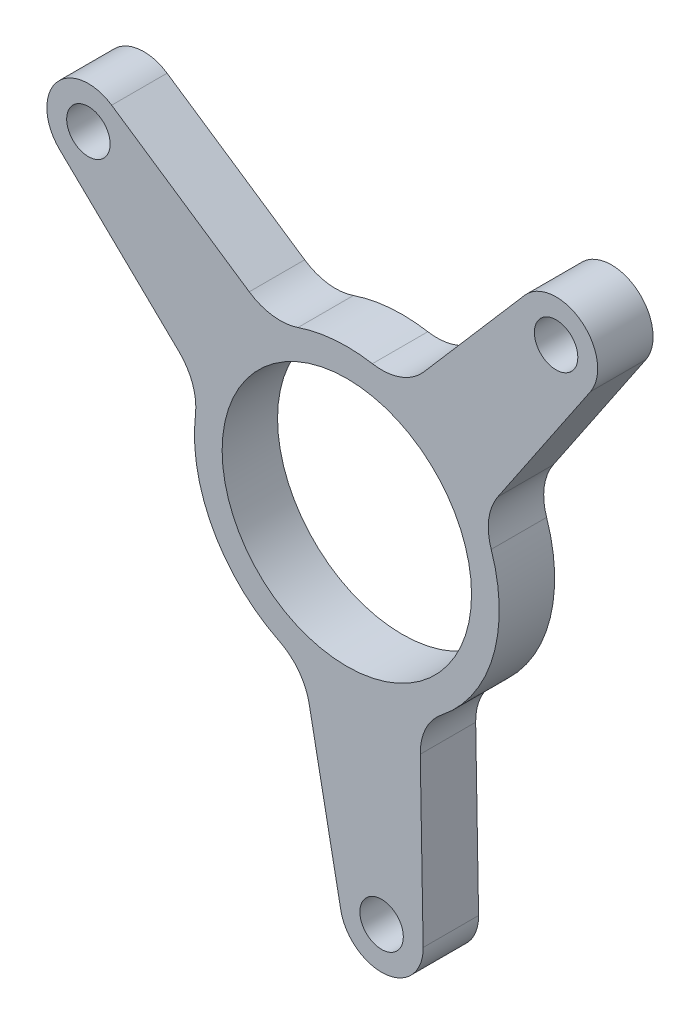
ISO-10303-21;
HEADER;
FILE_DESCRIPTION(('STEP AP214'),'2;1');
FILE_NAME('part.step','',(''),(''),'','','');
FILE_SCHEMA(('AUTOMOTIVE_DESIGN { 1 0 10303 214 1 1 1 1 }'));
ENDSEC;
DATA;
#1=APPLICATION_CONTEXT('core data for automotive mechanical design processes');
#2=APPLICATION_PROTOCOL_DEFINITION('international standard','automotive_design',2000,#1);
#3=PRODUCT_CONTEXT('',#1,'mechanical');
#4=PRODUCT('Part','Part','',(#3));
#5=PRODUCT_RELATED_PRODUCT_CATEGORY('part','',(#4));
#6=PRODUCT_DEFINITION_FORMATION('','',#4);
#7=PRODUCT_DEFINITION_CONTEXT('part definition',#1,'design');
#8=PRODUCT_DEFINITION('design','',#6,#7);
#9=PRODUCT_DEFINITION_SHAPE('','',#8);
#10=(LENGTH_UNIT() NAMED_UNIT(*) SI_UNIT(.MILLI.,.METRE.));
#11=(NAMED_UNIT(*) PLANE_ANGLE_UNIT() SI_UNIT($,.RADIAN.));
#12=(NAMED_UNIT(*) SI_UNIT($,.STERADIAN.) SOLID_ANGLE_UNIT());
#13=UNCERTAINTY_MEASURE_WITH_UNIT(LENGTH_MEASURE(1.E-05),#10,'distance_accuracy_value','');
#14=(GEOMETRIC_REPRESENTATION_CONTEXT(3) GLOBAL_UNCERTAINTY_ASSIGNED_CONTEXT((#13)) GLOBAL_UNIT_ASSIGNED_CONTEXT((#10,
#11,#12)) REPRESENTATION_CONTEXT('',''));
#15=CARTESIAN_POINT('',(0.,0.,0.));
#16=DIRECTION('',(0.,0.,1.));
#17=DIRECTION('',(1.,0.,0.));
#18=AXIS2_PLACEMENT_3D('',#15,#16,#17);
#19=CARTESIAN_POINT('',(561.207447136992,177.700999944,3.175));
#20=DIRECTION('',(0.,0.,-1.));
#21=DIRECTION('',(-1.,0.,0.));
#22=AXIS2_PLACEMENT_3D('',#19,#20,#21);
#23=CYLINDRICAL_SURFACE('',#22,17.4625);
#24=CARTESIAN_POINT('',(561.207447136992,177.700999944,3.175));
#25=DIRECTION('',(0.,0.,1.));
#26=DIRECTION('',(1.,0.,0.));
#27=AXIS2_PLACEMENT_3D('',#24,#25,#26);
#28=CIRCLE('',#27,17.4625);
#29=CARTESIAN_POINT('',(572.032534224423,163.998576953903,3.175));
#30=VERTEX_POINT('',#29);
#31=CARTESIAN_POINT('',(577.749003507361,183.297053830081,3.175));
#32=VERTEX_POINT('',#31);
#33=EDGE_CURVE('E185',#30,#32,#28,.T.);
#34=ORIENTED_EDGE('',*,*,#33,.F.);
#35=DIRECTION('',(0.,0.,-1.));
#36=VECTOR('',#35,1.);
#37=CARTESIAN_POINT('',(572.032534224423,163.998576953903,3.175));
#38=LINE('',#37,#36);
#39=CARTESIAN_POINT('',(572.032534224423,163.998576953903,-3.175));
#40=VERTEX_POINT('',#39);
#41=EDGE_CURVE('E269',#30,#40,#38,.T.);
#42=ORIENTED_EDGE('',*,*,#41,.T.);
#43=CARTESIAN_POINT('',(561.207447136992,177.700999944,-3.175));
#44=DIRECTION('',(0.,0.,1.));
#45=DIRECTION('',(1.,0.,0.));
#46=AXIS2_PLACEMENT_3D('',#43,#44,#45);
#47=CIRCLE('',#46,17.4625);
#48=CARTESIAN_POINT('',(577.749003507361,183.297053830081,-3.175));
#49=VERTEX_POINT('',#48);
#50=EDGE_CURVE('E222',#40,#49,#47,.T.);
#51=ORIENTED_EDGE('',*,*,#50,.T.);
#52=DIRECTION('',(0.,0.,-1.));
#53=VECTOR('',#52,1.);
#54=CARTESIAN_POINT('',(577.749003507361,183.297053830081,3.175));
#55=LINE('',#54,#53);
#56=EDGE_CURVE('E171',#49,#32,#55,.F.);
#57=ORIENTED_EDGE('',*,*,#56,.T.);
#58=EDGE_LOOP('',(#34,#42,#51,#57));
#59=FACE_BOUND('',#58,.T.);
#60=ADVANCED_FACE('F39',(#59),#23,.T.);
#61=CARTESIAN_POINT('',(310.040201133185,-209.124756227873,3.175));
#62=DIRECTION('',(0.829037572555041,-0.559192903470748,0.));
#63=DIRECTION('',(0.559192903470748,0.829037572555041,0.));
#64=AXIS2_PLACEMENT_3D('',#61,#62,#63);
#65=PLANE('',#64);
#66=DIRECTION('',(-0.559192903470748,-0.829037572555041,0.));
#67=VECTOR('',#66,1.);
#68=CARTESIAN_POINT('',(310.040201133185,-209.124756227873,3.175));
#69=LINE('',#68,#67);
#70=CARTESIAN_POINT('',(589.132845475284,204.647104872731,3.175));
#71=VERTEX_POINT('',#70);
#72=CARTESIAN_POINT('',(578.499726329043,188.882857452968,3.175));
#73=VERTEX_POINT('',#72);
#74=EDGE_CURVE('E166',#71,#73,#69,.T.);
#75=ORIENTED_EDGE('',*,*,#74,.T.);
#76=DIRECTION('',(0.,0.,-1.));
#77=VECTOR('',#76,1.);
#78=CARTESIAN_POINT('',(578.499726329043,188.882857452968,3.175));
#79=LINE('',#78,#77);
#80=CARTESIAN_POINT('',(578.499726329043,188.882857452968,-3.175));
#81=VERTEX_POINT('',#80);
#82=EDGE_CURVE('E294',#73,#81,#79,.T.);
#83=ORIENTED_EDGE('',*,*,#82,.T.);
#84=DIRECTION('',(-0.559192903470748,-0.829037572555041,0.));
#85=VECTOR('',#84,1.);
#86=CARTESIAN_POINT('',(310.040201133185,-209.124756227873,-3.175));
#87=LINE('',#86,#85);
#88=CARTESIAN_POINT('',(589.132845475284,204.647104872731,-3.175));
#89=VERTEX_POINT('',#88);
#90=EDGE_CURVE('E168',#89,#81,#87,.T.);
#91=ORIENTED_EDGE('',*,*,#90,.F.);
#92=DIRECTION('',(0.,0.,-1.));
#93=VECTOR('',#92,1.);
#94=CARTESIAN_POINT('',(589.132845475284,204.647104872731,3.175));
#95=LINE('',#94,#93);
#96=EDGE_CURVE('E163',#71,#89,#95,.T.);
#97=ORIENTED_EDGE('',*,*,#96,.F.);
#98=EDGE_LOOP('',(#75,#83,#91,#97));
#99=FACE_BOUND('',#98,.T.);
#100=ADVANCED_FACE('F165',(#99),#65,.T.);
#101=CARTESIAN_POINT('',(585.184554035991,207.310261075511,3.175));
#102=DIRECTION('',(0.,0.,-1.));
#103=DIRECTION('',(-1.,0.,0.));
#104=AXIS2_PLACEMENT_3D('',#101,#102,#103);
#105=CYLINDRICAL_SURFACE('',#104,4.76250000000001);
#106=CARTESIAN_POINT('',(585.184554035991,207.310261075511,-3.175));
#107=DIRECTION('',(0.,0.,1.));
#108=DIRECTION('',(1.,0.,0.));
#109=AXIS2_PLACEMENT_3D('',#106,#107,#108);
#110=CIRCLE('',#109,4.76250000000001);
#111=CARTESIAN_POINT('',(581.580038362951,210.422956533279,-3.175));
#112=VERTEX_POINT('',#111);
#113=EDGE_CURVE('E230',#89,#112,#110,.T.);
#114=ORIENTED_EDGE('',*,*,#113,.T.);
#115=DIRECTION('',(0.,0.,-1.));
#116=VECTOR('',#115,1.);
#117=CARTESIAN_POINT('',(581.580038362951,210.422956533279,3.175));
#118=LINE('',#117,#116);
#119=CARTESIAN_POINT('',(581.580038362951,210.422956533279,3.175));
#120=VERTEX_POINT('',#119);
#121=EDGE_CURVE('E172',#120,#112,#118,.T.);
#122=ORIENTED_EDGE('',*,*,#121,.F.);
#123=CARTESIAN_POINT('',(585.184554035991,207.310261075511,3.175));
#124=DIRECTION('',(0.,0.,1.));
#125=DIRECTION('',(1.,0.,0.));
#126=AXIS2_PLACEMENT_3D('',#123,#124,#125);
#127=CIRCLE('',#126,4.76250000000001);
#128=EDGE_CURVE('E175',#71,#120,#127,.T.);
#129=ORIENTED_EDGE('',*,*,#128,.F.);
#130=ORIENTED_EDGE('',*,*,#96,.T.);
#131=EDGE_LOOP('',(#114,#122,#129,#130));
#132=FACE_BOUND('',#131,.T.);
#133=ADVANCED_FACE('F176',(#132),#105,.T.);
#134=CARTESIAN_POINT('',(229.055594808824,-197.801972362193,3.175));
#135=DIRECTION('',(0.756853684627823,-0.653584348087749,0.));
#136=DIRECTION('',(0.653584348087749,0.756853684627824,0.));
#137=AXIS2_PLACEMENT_3D('',#134,#135,#136);
#138=PLANE('',#137);
#139=DIRECTION('',(-0.653584348087749,-0.756853684627824,0.));
#140=VECTOR('',#139,1.);
#141=CARTESIAN_POINT('',(229.055594808824,-197.801972362193,-3.175));
#142=LINE('',#141,#140);
#143=CARTESIAN_POINT('',(570.0105038316,197.025382272051,-3.175));
#144=VERTEX_POINT('',#143);
#145=EDGE_CURVE('E227',#112,#144,#142,.T.);
#146=ORIENTED_EDGE('',*,*,#145,.T.);
#147=DIRECTION('',(0.,0.,1.));
#148=VECTOR('',#147,1.);
#149=CARTESIAN_POINT('',(570.0105038316,197.025382272051,3.175));
#150=LINE('',#149,#148);
#151=CARTESIAN_POINT('',(570.0105038316,197.025382272051,3.175));
#152=VERTEX_POINT('',#151);
#153=EDGE_CURVE('E292',#144,#152,#150,.T.);
#154=ORIENTED_EDGE('',*,*,#153,.T.);
#155=DIRECTION('',(-0.653584348087749,-0.756853684627824,0.));
#156=VECTOR('',#155,1.);
#157=CARTESIAN_POINT('',(229.055594808824,-197.801972362193,3.175));
#158=LINE('',#157,#156);
#159=EDGE_CURVE('E180',#120,#152,#158,.T.);
#160=ORIENTED_EDGE('',*,*,#159,.F.);
#161=ORIENTED_EDGE('',*,*,#121,.T.);
#162=EDGE_LOOP('',(#146,#154,#160,#161));
#163=FACE_BOUND('',#162,.T.);
#164=ADVANCED_FACE('F342',(#163),#138,.F.);
#165=CARTESIAN_POINT('',(564.138606721621,194.915738098832,-3.175));
#166=VERTEX_POINT('',#165);
#167=CARTESIAN_POINT('',(555.611393250911,194.242556314368,-3.175));
#168=VERTEX_POINT('',#167);
#169=EDGE_CURVE('E223',#166,#168,#47,.T.);
#170=ORIENTED_EDGE('',*,*,#169,.T.);
#171=DIRECTION('',(0.,0.,-1.));
#172=VECTOR('',#171,1.);
#173=CARTESIAN_POINT('',(555.611393250911,194.242556314368,3.175));
#174=LINE('',#173,#172);
#175=CARTESIAN_POINT('',(555.611393250911,194.242556314368,3.175));
#176=VERTEX_POINT('',#175);
#177=EDGE_CURVE('E290',#168,#176,#174,.F.);
#178=ORIENTED_EDGE('',*,*,#177,.T.);
#179=CARTESIAN_POINT('',(564.138606721621,194.915738098832,3.175));
#180=VERTEX_POINT('',#179);
#181=EDGE_CURVE('E189',#180,#176,#28,.T.);
#182=ORIENTED_EDGE('',*,*,#181,.F.);
#183=DIRECTION('',(0.,0.,-1.));
#184=VECTOR('',#183,1.);
#185=CARTESIAN_POINT('',(564.138606721621,194.915738098832,3.175));
#186=LINE('',#185,#184);
#187=EDGE_CURVE('E287',#180,#166,#186,.T.);
#188=ORIENTED_EDGE('',*,*,#187,.T.);
#189=EDGE_LOOP('',(#170,#178,#182,#188));
#190=FACE_BOUND('',#189,.T.);
#191=ADVANCED_FACE('F332',(#190),#23,.T.);
#192=CARTESIAN_POINT('',(262.388498684941,389.006946736943,3.175));
#193=DIRECTION('',(0.559192903470754,0.829037572555037,0.));
#194=DIRECTION('',(-0.829037572555037,0.559192903470754,0.));
#195=AXIS2_PLACEMENT_3D('',#192,#193,#194);
#196=PLANE('',#195);
#197=DIRECTION('',(0.829037572555037,-0.559192903470754,0.));
#198=VECTOR('',#197,1.);
#199=CARTESIAN_POINT('',(262.388498684941,389.006946736943,3.175));
#200=LINE('',#199,#198);
#201=CARTESIAN_POINT('',(534.261342208261,205.626398282292,3.175));
#202=VERTEX_POINT('',#201);
#203=CARTESIAN_POINT('',(550.025589628025,194.993279136051,3.175));
#204=VERTEX_POINT('',#203);
#205=EDGE_CURVE('E194',#202,#204,#200,.T.);
#206=ORIENTED_EDGE('',*,*,#205,.T.);
#207=DIRECTION('',(0.,0.,-1.));
#208=VECTOR('',#207,1.);
#209=CARTESIAN_POINT('',(550.025589628024,194.993279136051,3.175));
#210=LINE('',#209,#208);
#211=CARTESIAN_POINT('',(550.025589628025,194.993279136051,-3.175));
#212=VERTEX_POINT('',#211);
#213=EDGE_CURVE('E284',#204,#212,#210,.T.);
#214=ORIENTED_EDGE('',*,*,#213,.T.);
#215=DIRECTION('',(0.829037572555037,-0.559192903470754,0.));
#216=VECTOR('',#215,1.);
#217=CARTESIAN_POINT('',(262.388498684941,389.006946736943,-3.175));
#218=LINE('',#217,#216);
#219=CARTESIAN_POINT('',(534.261342208261,205.626398282292,-3.175));
#220=VERTEX_POINT('',#219);
#221=EDGE_CURVE('E226',#220,#212,#218,.T.);
#222=ORIENTED_EDGE('',*,*,#221,.F.);
#223=DIRECTION('',(0.,0.,-1.));
#224=VECTOR('',#223,1.);
#225=CARTESIAN_POINT('',(534.261342208261,205.626398282292,3.175));
#226=LINE('',#225,#224);
#227=EDGE_CURVE('E265',#202,#220,#226,.T.);
#228=ORIENTED_EDGE('',*,*,#227,.F.);
#229=EDGE_LOOP('',(#206,#214,#222,#228));
#230=FACE_BOUND('',#229,.T.);
#231=ADVANCED_FACE('F341',(#230),#196,.T.);
#232=CARTESIAN_POINT('',(531.598186005482,201.678106842999,3.175));
#233=DIRECTION('',(0.,0.,-1.));
#234=DIRECTION('',(-1.,0.,0.));
#235=AXIS2_PLACEMENT_3D('',#232,#233,#234);
#236=CYLINDRICAL_SURFACE('',#235,4.76250000000001);
#237=CARTESIAN_POINT('',(531.598186005482,201.678106842999,-3.175));
#238=DIRECTION('',(0.,0.,1.));
#239=DIRECTION('',(1.,0.,0.));
#240=AXIS2_PLACEMENT_3D('',#237,#238,#239);
#241=CIRCLE('',#240,4.76250000000001);
#242=CARTESIAN_POINT('',(528.289875516171,198.252251043886,-3.175));
#243=VERTEX_POINT('',#242);
#244=EDGE_CURVE('E236',#220,#243,#241,.T.);
#245=ORIENTED_EDGE('',*,*,#244,.T.);
#246=DIRECTION('',(0.,0.,-1.));
#247=VECTOR('',#246,1.);
#248=CARTESIAN_POINT('',(528.289875516171,198.252251043886,3.175));
#249=LINE('',#248,#247);
#250=CARTESIAN_POINT('',(528.289875516171,198.252251043886,3.175));
#251=VERTEX_POINT('',#250);
#252=EDGE_CURVE('E262',#251,#243,#249,.T.);
#253=ORIENTED_EDGE('',*,*,#252,.F.);
#254=CARTESIAN_POINT('',(531.598186005482,201.678106842999,3.175));
#255=DIRECTION('',(0.,0.,1.));
#256=DIRECTION('',(1.,0.,0.));
#257=AXIS2_PLACEMENT_3D('',#254,#255,#256);
#258=CIRCLE('',#257,4.76250000000001);
#259=EDGE_CURVE('E197',#202,#251,#258,.T.);
#260=ORIENTED_EDGE('',*,*,#259,.F.);
#261=ORIENTED_EDGE('',*,*,#227,.T.);
#262=EDGE_LOOP('',(#245,#253,#260,#261));
#263=FACE_BOUND('',#262,.T.);
#264=ADVANCED_FACE('F354',(#263),#236,.T.);
#265=CARTESIAN_POINT('',(353.992152938388,366.569605211689,3.175));
#266=DIRECTION('',(0.694658370458996,0.719339800338652,0.));
#267=DIRECTION('',(-0.719339800338652,0.694658370458996,0.));
#268=AXIS2_PLACEMENT_3D('',#265,#266,#267);
#269=PLANE('',#268);
#270=DIRECTION('',(0.719339800338652,-0.694658370458996,0.));
#271=VECTOR('',#270,1.);
#272=CARTESIAN_POINT('',(353.992152938388,366.569605211689,-3.175));
#273=LINE('',#272,#271);
#274=CARTESIAN_POINT('',(541.968206832896,185.043240033233,-3.175));
#275=VERTEX_POINT('',#274);
#276=EDGE_CURVE('E238',#243,#275,#273,.T.);
#277=ORIENTED_EDGE('',*,*,#276,.T.);
#278=DIRECTION('',(0.,0.,1.));
#279=VECTOR('',#278,1.);
#280=CARTESIAN_POINT('',(541.968206832896,185.043240033233,3.175));
#281=LINE('',#280,#279);
#282=CARTESIAN_POINT('',(541.968206832896,185.043240033233,3.175));
#283=VERTEX_POINT('',#282);
#284=EDGE_CURVE('E282',#275,#283,#281,.T.);
#285=ORIENTED_EDGE('',*,*,#284,.T.);
#286=DIRECTION('',(0.719339800338652,-0.694658370458996,0.));
#287=VECTOR('',#286,1.);
#288=CARTESIAN_POINT('',(353.992152938388,366.569605211689,3.175));
#289=LINE('',#288,#287);
#290=EDGE_CURVE('E199',#251,#283,#289,.T.);
#291=ORIENTED_EDGE('',*,*,#290,.F.);
#292=ORIENTED_EDGE('',*,*,#252,.T.);
#293=EDGE_LOOP('',(#277,#285,#291,#292));
#294=FACE_BOUND('',#293,.T.);
#295=ADVANCED_FACE('F346',(#294),#269,.F.);
#296=CARTESIAN_POINT('',(543.863878435551,179.735583672527,-3.175));
#297=VERTEX_POINT('',#296);
#298=CARTESIAN_POINT('',(553.467808106859,162.0473456124,-3.175));
#299=VERTEX_POINT('',#298);
#300=EDGE_CURVE('E228',#297,#299,#47,.T.);
#301=ORIENTED_EDGE('',*,*,#300,.T.);
#302=DIRECTION('',(0.,0.,-1.));
#303=VECTOR('',#302,1.);
#304=CARTESIAN_POINT('',(553.467808106859,162.0473456124,3.175));
#305=LINE('',#304,#303);
#306=CARTESIAN_POINT('',(553.467808106859,162.0473456124,3.175));
#307=VERTEX_POINT('',#306);
#308=EDGE_CURVE('E280',#299,#307,#305,.F.);
#309=ORIENTED_EDGE('',*,*,#308,.T.);
#310=CARTESIAN_POINT('',(543.863878435551,179.735583672527,3.175));
#311=VERTEX_POINT('',#310);
#312=EDGE_CURVE('E190',#311,#307,#28,.T.);
#313=ORIENTED_EDGE('',*,*,#312,.F.);
#314=DIRECTION('',(0.,0.,-1.));
#315=VECTOR('',#314,1.);
#316=CARTESIAN_POINT('',(543.863878435551,179.735583672527,3.175));
#317=LINE('',#316,#315);
#318=EDGE_CURVE('E277',#311,#297,#317,.T.);
#319=ORIENTED_EDGE('',*,*,#318,.T.);
#320=EDGE_LOOP('',(#301,#309,#313,#319));
#321=FACE_BOUND('',#320,.T.);
#322=ADVANCED_FACE('F333',(#321),#23,.T.);
#323=CARTESIAN_POINT('',(566.124324846105,110.043421273969,3.175));
#324=DIRECTION('',(0.981627183447664,0.190808995376547,0.));
#325=DIRECTION('',(-0.190808995376547,0.981627183447664,0.));
#326=AXIS2_PLACEMENT_3D('',#323,#324,#325);
#327=PLANE('',#326);
#328=DIRECTION('',(0.190808995376547,-0.981627183447664,0.));
#329=VECTOR('',#328,1.);
#330=CARTESIAN_POINT('',(566.124324846105,110.043421273969,3.175));
#331=LINE('',#330,#329);
#332=CARTESIAN_POINT('',(556.886726528975,157.566744794277,3.175));
#333=VERTEX_POINT('',#332);
#334=CARTESIAN_POINT('',(560.514982126321,138.900987889988,3.175));
#335=VERTEX_POINT('',#334);
#336=EDGE_CURVE('E202',#333,#335,#331,.T.);
#337=ORIENTED_EDGE('',*,*,#336,.F.);
#338=DIRECTION('',(0.,0.,1.));
#339=VECTOR('',#338,1.);
#340=CARTESIAN_POINT('',(556.886726528975,157.566744794277,-3.175));
#341=LINE('',#340,#339);
#342=CARTESIAN_POINT('',(556.886726528975,157.566744794277,-3.175));
#343=VERTEX_POINT('',#342);
#344=EDGE_CURVE('E274',#333,#343,#341,.F.);
#345=ORIENTED_EDGE('',*,*,#344,.T.);
#346=DIRECTION('',(0.190808995376547,-0.981627183447664,0.));
#347=VECTOR('',#346,1.);
#348=CARTESIAN_POINT('',(566.124324846105,110.043421273969,-3.175));
#349=LINE('',#348,#347);
#350=CARTESIAN_POINT('',(560.514982126321,138.900987889988,-3.175));
#351=VERTEX_POINT('',#350);
#352=EDGE_CURVE('E241',#343,#351,#349,.T.);
#353=ORIENTED_EDGE('',*,*,#352,.T.);
#354=DIRECTION('',(0.,0.,-1.));
#355=VECTOR('',#354,1.);
#356=CARTESIAN_POINT('',(560.514982126321,138.900987889988,3.175));
#357=LINE('',#356,#355);
#358=EDGE_CURVE('E259',#335,#351,#357,.T.);
#359=ORIENTED_EDGE('',*,*,#358,.F.);
#360=EDGE_LOOP('',(#337,#345,#353,#359));
#361=FACE_BOUND('',#360,.T.);
#362=ADVANCED_FACE('F345',(#361),#327,.F.);
#363=CARTESIAN_POINT('',(565.18998158749,139.809715730469,3.175));
#364=DIRECTION('',(0.,0.,-1.));
#365=DIRECTION('',(-1.,0.,0.));
#366=AXIS2_PLACEMENT_3D('',#363,#364,#365);
#367=CYLINDRICAL_SURFACE('',#366,4.76250000000001);
#368=CARTESIAN_POINT('',(565.18998158749,139.809715730469,-3.175));
#369=DIRECTION('',(0.,0.,1.));
#370=DIRECTION('',(1.,0.,0.));
#371=AXIS2_PLACEMENT_3D('',#368,#369,#370);
#372=CIRCLE('',#371,4.76250000000001);
#373=CARTESIAN_POINT('',(569.951756235673,139.892832816126,-3.175));
#374=VERTEX_POINT('',#373);
#375=EDGE_CURVE('E243',#351,#374,#372,.T.);
#376=ORIENTED_EDGE('',*,*,#375,.T.);
#377=DIRECTION('',(0.,0.,-1.));
#378=VECTOR('',#377,1.);
#379=CARTESIAN_POINT('',(569.951756235673,139.892832816126,3.175));
#380=LINE('',#379,#378);
#381=CARTESIAN_POINT('',(569.951756235673,139.892832816126,3.175));
#382=VERTEX_POINT('',#381);
#383=EDGE_CURVE('E218',#382,#374,#380,.T.);
#384=ORIENTED_EDGE('',*,*,#383,.F.);
#385=CARTESIAN_POINT('',(565.18998158749,139.809715730469,3.175));
#386=DIRECTION('',(0.,0.,1.));
#387=DIRECTION('',(1.,0.,0.));
#388=AXIS2_PLACEMENT_3D('',#385,#386,#387);
#389=CIRCLE('',#388,4.76250000000001);
#390=EDGE_CURVE('E204',#335,#382,#389,.T.);
#391=ORIENTED_EDGE('',*,*,#390,.F.);
#392=ORIENTED_EDGE('',*,*,#358,.T.);
#393=EDGE_LOOP('',(#376,#384,#391,#392));
#394=FACE_BOUND('',#393,.T.);
#395=ADVANCED_FACE('F352',(#394),#367,.T.);
#396=CARTESIAN_POINT('',(531.598186005482,201.678106842999,3.175));
#397=DIRECTION('',(0.,0.,-1.));
#398=DIRECTION('',(-1.,0.,0.));
#399=AXIS2_PLACEMENT_3D('',#396,#397,#398);
#400=CYLINDRICAL_SURFACE('',#399,2.48919999999995);
#401=CARTESIAN_POINT('',(531.598186005482,201.678106842999,3.175));
#402=DIRECTION('',(0.,0.,1.));
#403=DIRECTION('',(1.,0.,0.));
#404=AXIS2_PLACEMENT_3D('',#401,#402,#403);
#405=CIRCLE('',#404,2.48919999999995);
#406=CARTESIAN_POINT('',(534.087386005482,201.678106842999,3.175));
#407=VERTEX_POINT('',#406);
#408=EDGE_CURVE('E212',#407,#407,#405,.T.);
#409=ORIENTED_EDGE('',*,*,#408,.T.);
#410=EDGE_LOOP('',(#409));
#411=FACE_BOUND('',#410,.T.);
#412=CARTESIAN_POINT('',(531.598186005482,201.678106842999,-3.175));
#413=DIRECTION('',(0.,0.,1.));
#414=DIRECTION('',(1.,0.,0.));
#415=AXIS2_PLACEMENT_3D('',#412,#413,#414);
#416=CIRCLE('',#415,2.48919999999995);
#417=CARTESIAN_POINT('',(534.087386005482,201.678106842999,-3.175));
#418=VERTEX_POINT('',#417);
#419=EDGE_CURVE('E251',#418,#418,#416,.T.);
#420=ORIENTED_EDGE('',*,*,#419,.F.);
#421=EDGE_LOOP('',(#420));
#422=FACE_BOUND('',#421,.T.);
#423=ADVANCED_FACE('F391',(#411,#422),#400,.F.);
#424=CARTESIAN_POINT('',(585.184554035991,207.310261075511,3.175));
#425=DIRECTION('',(0.,0.,-1.));
#426=DIRECTION('',(-1.,0.,0.));
#427=AXIS2_PLACEMENT_3D('',#424,#425,#426);
#428=CYLINDRICAL_SURFACE('',#427,2.48919999999995);
#429=CARTESIAN_POINT('',(585.184554035991,207.310261075511,3.175));
#430=DIRECTION('',(0.,0.,1.));
#431=DIRECTION('',(1.,0.,0.));
#432=AXIS2_PLACEMENT_3D('',#429,#430,#431);
#433=CIRCLE('',#432,2.48919999999995);
#434=CARTESIAN_POINT('',(587.673754035991,207.310261075511,3.175));
#435=VERTEX_POINT('',#434);
#436=EDGE_CURVE('E209',#435,#435,#433,.T.);
#437=ORIENTED_EDGE('',*,*,#436,.T.);
#438=EDGE_LOOP('',(#437));
#439=FACE_BOUND('',#438,.T.);
#440=CARTESIAN_POINT('',(585.184554035991,207.310261075511,-3.175));
#441=DIRECTION('',(0.,0.,1.));
#442=DIRECTION('',(1.,0.,0.));
#443=AXIS2_PLACEMENT_3D('',#440,#441,#442);
#444=CIRCLE('',#443,2.48919999999995);
#445=CARTESIAN_POINT('',(587.673754035991,207.310261075511,-3.175));
#446=VERTEX_POINT('',#445);
#447=EDGE_CURVE('E248',#446,#446,#444,.T.);
#448=ORIENTED_EDGE('',*,*,#447,.F.);
#449=EDGE_LOOP('',(#448));
#450=FACE_BOUND('',#449,.T.);
#451=ADVANCED_FACE('F382',(#439,#450),#428,.F.);
#452=CARTESIAN_POINT('',(572.219251359299,9.98812418565256,3.175));
#453=DIRECTION('',(0.999847695156391,0.0174524064372834,0.));
#454=DIRECTION('',(-0.0174524064372834,0.999847695156391,0.));
#455=AXIS2_PLACEMENT_3D('',#452,#453,#454);
#456=PLANE('',#455);
#457=DIRECTION('',(0.0174524064372834,-0.999847695156391,0.));
#458=VECTOR('',#457,1.);
#459=CARTESIAN_POINT('',(572.219251359299,9.98812418565256,-3.175));
#460=LINE('',#459,#458);
#461=CARTESIAN_POINT('',(569.619896664701,158.9050549039,-3.175));
#462=VERTEX_POINT('',#461);
#463=EDGE_CURVE('E246',#462,#374,#460,.T.);
#464=ORIENTED_EDGE('',*,*,#463,.F.);
#465=DIRECTION('',(0.,0.,-1.));
#466=VECTOR('',#465,1.);
#467=CARTESIAN_POINT('',(569.619896664701,158.9050549039,3.175));
#468=LINE('',#467,#466);
#469=CARTESIAN_POINT('',(569.619896664701,158.9050549039,3.175));
#470=VERTEX_POINT('',#469);
#471=EDGE_CURVE('E272',#462,#470,#468,.F.);
#472=ORIENTED_EDGE('',*,*,#471,.T.);
#473=DIRECTION('',(0.0174524064372834,-0.999847695156391,0.));
#474=VECTOR('',#473,1.);
#475=CARTESIAN_POINT('',(572.219251359299,9.98812418565256,3.175));
#476=LINE('',#475,#474);
#477=EDGE_CURVE('E207',#470,#382,#476,.T.);
#478=ORIENTED_EDGE('',*,*,#477,.T.);
#479=ORIENTED_EDGE('',*,*,#383,.T.);
#480=EDGE_LOOP('',(#464,#472,#478,#479));
#481=FACE_BOUND('',#480,.T.);
#482=ADVANCED_FACE('F379',(#481),#456,.T.);
#483=CARTESIAN_POINT('',(561.207447136992,177.700999944,3.175));
#484=DIRECTION('',(0.,0.,-1.));
#485=DIRECTION('',(-1.,0.,0.));
#486=AXIS2_PLACEMENT_3D('',#483,#484,#485);
#487=CYLINDRICAL_SURFACE('',#486,14.2875);
#488=CARTESIAN_POINT('',(561.207447136992,177.700999944,3.175));
#489=DIRECTION('',(0.,0.,1.));
#490=DIRECTION('',(1.,0.,0.));
#491=AXIS2_PLACEMENT_3D('',#488,#489,#490);
#492=CIRCLE('',#491,14.2875);
#493=CARTESIAN_POINT('',(575.494947136992,177.700999944,3.175));
#494=VERTEX_POINT('',#493);
#495=EDGE_CURVE('E187',#494,#494,#492,.T.);
#496=ORIENTED_EDGE('',*,*,#495,.T.);
#497=EDGE_LOOP('',(#496));
#498=FACE_BOUND('',#497,.T.);
#499=CARTESIAN_POINT('',(561.207447136992,177.700999944,-3.175));
#500=DIRECTION('',(0.,0.,1.));
#501=DIRECTION('',(1.,0.,0.));
#502=AXIS2_PLACEMENT_3D('',#499,#500,#501);
#503=CIRCLE('',#502,14.2875);
#504=CARTESIAN_POINT('',(575.494947136992,177.700999944,-3.175));
#505=VERTEX_POINT('',#504);
#506=EDGE_CURVE('E219',#505,#505,#503,.T.);
#507=ORIENTED_EDGE('',*,*,#506,.F.);
#508=EDGE_LOOP('',(#507));
#509=FACE_BOUND('',#508,.T.);
#510=ADVANCED_FACE('F381',(#498,#509),#487,.F.);
#511=CARTESIAN_POINT('',(565.18998158749,139.809715730469,3.175));
#512=DIRECTION('',(0.,0.,-1.));
#513=DIRECTION('',(-1.,0.,0.));
#514=AXIS2_PLACEMENT_3D('',#511,#512,#513);
#515=CYLINDRICAL_SURFACE('',#514,2.48919999999995);
#516=CARTESIAN_POINT('',(565.18998158749,139.809715730469,3.175));
#517=DIRECTION('',(0.,0.,1.));
#518=DIRECTION('',(1.,0.,0.));
#519=AXIS2_PLACEMENT_3D('',#516,#517,#518);
#520=CIRCLE('',#519,2.48919999999995);
#521=CARTESIAN_POINT('',(567.67918158749,139.809715730469,3.175));
#522=VERTEX_POINT('',#521);
#523=EDGE_CURVE('E215',#522,#522,#520,.T.);
#524=ORIENTED_EDGE('',*,*,#523,.T.);
#525=EDGE_LOOP('',(#524));
#526=FACE_BOUND('',#525,.T.);
#527=CARTESIAN_POINT('',(565.18998158749,139.809715730469,-3.175));
#528=DIRECTION('',(0.,0.,1.));
#529=DIRECTION('',(1.,0.,0.));
#530=AXIS2_PLACEMENT_3D('',#527,#528,#529);
#531=CIRCLE('',#530,2.48919999999995);
#532=CARTESIAN_POINT('',(567.67918158749,139.809715730469,-3.175));
#533=VERTEX_POINT('',#532);
#534=EDGE_CURVE('E254',#533,#533,#531,.T.);
#535=ORIENTED_EDGE('',*,*,#534,.F.);
#536=EDGE_LOOP('',(#535));
#537=FACE_BOUND('',#536,.T.);
#538=ADVANCED_FACE('F388',(#526,#537),#515,.F.);
#539=CARTESIAN_POINT('',(0.,0.,3.175));
#540=DIRECTION('',(0.,0.,1.));
#541=DIRECTION('',(1.,0.,0.));
#542=AXIS2_PLACEMENT_3D('',#539,#540,#541);
#543=PLANE('',#542);
#544=ORIENTED_EDGE('',*,*,#495,.F.);
#545=EDGE_LOOP('',(#544));
#546=FACE_BOUND('',#545,.T.);
#547=ORIENTED_EDGE('',*,*,#477,.F.);
#548=CARTESIAN_POINT('',(575.968929528944,159.015877684777,3.175));
#549=DIRECTION('',(0.,0.,1.));
#550=DIRECTION('',(1.,0.,0.));
#551=AXIS2_PLACEMENT_3D('',#548,#549,#550);
#552=CIRCLE('',#551,6.35);
#553=EDGE_CURVE('E298',#470,#30,#552,.F.);
#554=ORIENTED_EDGE('',*,*,#553,.T.);
#555=ORIENTED_EDGE('',*,*,#33,.T.);
#556=CARTESIAN_POINT('',(583.764114914767,185.331982515929,3.175));
#557=DIRECTION('',(0.,0.,1.));
#558=DIRECTION('',(1.,0.,0.));
#559=AXIS2_PLACEMENT_3D('',#556,#557,#558);
#560=CIRCLE('',#559,6.35);
#561=EDGE_CURVE('E11',#32,#73,#560,.F.);
#562=ORIENTED_EDGE('',*,*,#561,.T.);
#563=ORIENTED_EDGE('',*,*,#74,.F.);
#564=ORIENTED_EDGE('',*,*,#128,.T.);
#565=ORIENTED_EDGE('',*,*,#159,.T.);
#566=CARTESIAN_POINT('',(565.204482934213,201.175642882408,3.175));
#567=DIRECTION('',(0.,0.,1.));
#568=DIRECTION('',(1.,0.,0.));
#569=AXIS2_PLACEMENT_3D('',#566,#567,#568);
#570=CIRCLE('',#569,6.35);
#571=EDGE_CURVE('E314',#152,#180,#570,.F.);
#572=ORIENTED_EDGE('',*,*,#571,.T.);
#573=ORIENTED_EDGE('',*,*,#181,.T.);
#574=CARTESIAN_POINT('',(553.576464565064,200.257667721775,3.175));
#575=DIRECTION('',(0.,0.,1.));
#576=DIRECTION('',(1.,0.,0.));
#577=AXIS2_PLACEMENT_3D('',#574,#575,#576);
#578=CIRCLE('',#577,6.35);
#579=EDGE_CURVE('E310',#176,#204,#578,.F.);
#580=ORIENTED_EDGE('',*,*,#579,.T.);
#581=ORIENTED_EDGE('',*,*,#205,.F.);
#582=ORIENTED_EDGE('',*,*,#259,.T.);
#583=ORIENTED_EDGE('',*,*,#290,.T.);
#584=CARTESIAN_POINT('',(537.557126180482,180.475432301082,3.175));
#585=DIRECTION('',(0.,0.,1.));
#586=DIRECTION('',(1.,0.,0.));
#587=AXIS2_PLACEMENT_3D('',#584,#585,#586);
#588=CIRCLE('',#587,6.35);
#589=EDGE_CURVE('E306',#283,#311,#588,.F.);
#590=ORIENTED_EDGE('',*,*,#589,.T.);
#591=ORIENTED_EDGE('',*,*,#312,.T.);
#592=CARTESIAN_POINT('',(550.653393914083,156.355107673636,3.175));
#593=DIRECTION('',(0.,0.,1.));
#594=DIRECTION('',(1.,0.,0.));
#595=AXIS2_PLACEMENT_3D('',#592,#593,#594);
#596=CIRCLE('',#595,6.35);
#597=EDGE_CURVE('E302',#307,#333,#596,.F.);
#598=ORIENTED_EDGE('',*,*,#597,.T.);
#599=ORIENTED_EDGE('',*,*,#336,.T.);
#600=ORIENTED_EDGE('',*,*,#390,.T.);
#601=EDGE_LOOP('',(#547,#554,#555,#562,#563,#564,#565,#572,#573,#580,#581,#582,#583,#590,#591,
#598,#599,#600));
#602=FACE_BOUND('',#601,.T.);
#603=ORIENTED_EDGE('',*,*,#436,.F.);
#604=EDGE_LOOP('',(#603));
#605=FACE_BOUND('',#604,.T.);
#606=ORIENTED_EDGE('',*,*,#408,.F.);
#607=EDGE_LOOP('',(#606));
#608=FACE_BOUND('',#607,.T.);
#609=ORIENTED_EDGE('',*,*,#523,.F.);
#610=EDGE_LOOP('',(#609));
#611=FACE_BOUND('',#610,.T.);
#612=ADVANCED_FACE('F183',(#546,#602,#605,#608,#611),#543,.T.);
#613=CARTESIAN_POINT('',(0.,0.,-3.175));
#614=DIRECTION('',(0.,0.,1.));
#615=DIRECTION('',(1.,0.,0.));
#616=AXIS2_PLACEMENT_3D('',#613,#614,#615);
#617=PLANE('',#616);
#618=ORIENTED_EDGE('',*,*,#506,.T.);
#619=EDGE_LOOP('',(#618));
#620=FACE_BOUND('',#619,.T.);
#621=ORIENTED_EDGE('',*,*,#50,.F.);
#622=CARTESIAN_POINT('',(575.968929528944,159.015877684777,-3.175));
#623=DIRECTION('',(0.,0.,1.));
#624=DIRECTION('',(1.,0.,0.));
#625=AXIS2_PLACEMENT_3D('',#622,#623,#624);
#626=CIRCLE('',#625,6.35);
#627=EDGE_CURVE('E296',#40,#462,#626,.T.);
#628=ORIENTED_EDGE('',*,*,#627,.T.);
#629=ORIENTED_EDGE('',*,*,#463,.T.);
#630=ORIENTED_EDGE('',*,*,#375,.F.);
#631=ORIENTED_EDGE('',*,*,#352,.F.);
#632=CARTESIAN_POINT('',(550.653393914083,156.355107673636,-3.175));
#633=DIRECTION('',(0.,0.,1.));
#634=DIRECTION('',(1.,0.,0.));
#635=AXIS2_PLACEMENT_3D('',#632,#633,#634);
#636=CIRCLE('',#635,6.35);
#637=EDGE_CURVE('E300',#343,#299,#636,.T.);
#638=ORIENTED_EDGE('',*,*,#637,.T.);
#639=ORIENTED_EDGE('',*,*,#300,.F.);
#640=CARTESIAN_POINT('',(537.557126180482,180.475432301082,-3.175));
#641=DIRECTION('',(0.,0.,1.));
#642=DIRECTION('',(1.,0.,0.));
#643=AXIS2_PLACEMENT_3D('',#640,#641,#642);
#644=CIRCLE('',#643,6.35);
#645=EDGE_CURVE('E304',#297,#275,#644,.T.);
#646=ORIENTED_EDGE('',*,*,#645,.T.);
#647=ORIENTED_EDGE('',*,*,#276,.F.);
#648=ORIENTED_EDGE('',*,*,#244,.F.);
#649=ORIENTED_EDGE('',*,*,#221,.T.);
#650=CARTESIAN_POINT('',(553.576464565064,200.257667721775,-3.175));
#651=DIRECTION('',(0.,0.,1.));
#652=DIRECTION('',(1.,0.,0.));
#653=AXIS2_PLACEMENT_3D('',#650,#651,#652);
#654=CIRCLE('',#653,6.35);
#655=EDGE_CURVE('E308',#212,#168,#654,.T.);
#656=ORIENTED_EDGE('',*,*,#655,.T.);
#657=ORIENTED_EDGE('',*,*,#169,.F.);
#658=CARTESIAN_POINT('',(565.204482934213,201.175642882408,-3.175));
#659=DIRECTION('',(0.,0.,1.));
#660=DIRECTION('',(1.,0.,0.));
#661=AXIS2_PLACEMENT_3D('',#658,#659,#660);
#662=CIRCLE('',#661,6.35);
#663=EDGE_CURVE('E312',#166,#144,#662,.T.);
#664=ORIENTED_EDGE('',*,*,#663,.T.);
#665=ORIENTED_EDGE('',*,*,#145,.F.);
#666=ORIENTED_EDGE('',*,*,#113,.F.);
#667=ORIENTED_EDGE('',*,*,#90,.T.);
#668=CARTESIAN_POINT('',(583.764114914767,185.331982515929,-3.175));
#669=DIRECTION('',(0.,0.,1.));
#670=DIRECTION('',(1.,0.,0.));
#671=AXIS2_PLACEMENT_3D('',#668,#669,#670);
#672=CIRCLE('',#671,6.35);
#673=EDGE_CURVE('E47',#81,#49,#672,.T.);
#674=ORIENTED_EDGE('',*,*,#673,.T.);
#675=EDGE_LOOP('',(#621,#628,#629,#630,#631,#638,#639,#646,#647,#648,#649,#656,#657,#664,#665,
#666,#667,#674));
#676=FACE_BOUND('',#675,.T.);
#677=ORIENTED_EDGE('',*,*,#447,.T.);
#678=EDGE_LOOP('',(#677));
#679=FACE_BOUND('',#678,.T.);
#680=ORIENTED_EDGE('',*,*,#419,.T.);
#681=EDGE_LOOP('',(#680));
#682=FACE_BOUND('',#681,.T.);
#683=ORIENTED_EDGE('',*,*,#534,.T.);
#684=EDGE_LOOP('',(#683));
#685=FACE_BOUND('',#684,.T.);
#686=ADVANCED_FACE('F318',(#620,#676,#679,#682,#685),#617,.F.);
#687=CARTESIAN_POINT('',(575.968929528944,159.015877684777,3.175));
#688=DIRECTION('',(0.,0.,-1.));
#689=DIRECTION('',(-1.,0.,0.));
#690=AXIS2_PLACEMENT_3D('',#687,#688,#689);
#691=CYLINDRICAL_SURFACE('',#690,6.35);
#692=ORIENTED_EDGE('',*,*,#553,.F.);
#693=ORIENTED_EDGE('',*,*,#471,.F.);
#694=ORIENTED_EDGE('',*,*,#627,.F.);
#695=ORIENTED_EDGE('',*,*,#41,.F.);
#696=EDGE_LOOP('',(#692,#693,#694,#695));
#697=FACE_BOUND('',#696,.T.);
#698=ADVANCED_FACE('F377',(#697),#691,.F.);
#699=CARTESIAN_POINT('',(550.653393914083,156.355107673636,3.175));
#700=DIRECTION('',(0.,0.,-1.));
#701=DIRECTION('',(-1.,0.,0.));
#702=AXIS2_PLACEMENT_3D('',#699,#700,#701);
#703=CYLINDRICAL_SURFACE('',#702,6.35);
#704=ORIENTED_EDGE('',*,*,#597,.F.);
#705=ORIENTED_EDGE('',*,*,#308,.F.);
#706=ORIENTED_EDGE('',*,*,#637,.F.);
#707=ORIENTED_EDGE('',*,*,#344,.F.);
#708=EDGE_LOOP('',(#704,#705,#706,#707));
#709=FACE_BOUND('',#708,.T.);
#710=ADVANCED_FACE('F364',(#709),#703,.F.);
#711=CARTESIAN_POINT('',(537.557126180482,180.475432301082,3.175));
#712=DIRECTION('',(0.,0.,-1.));
#713=DIRECTION('',(-1.,0.,0.));
#714=AXIS2_PLACEMENT_3D('',#711,#712,#713);
#715=CYLINDRICAL_SURFACE('',#714,6.35);
#716=ORIENTED_EDGE('',*,*,#589,.F.);
#717=ORIENTED_EDGE('',*,*,#284,.F.);
#718=ORIENTED_EDGE('',*,*,#645,.F.);
#719=ORIENTED_EDGE('',*,*,#318,.F.);
#720=EDGE_LOOP('',(#716,#717,#718,#719));
#721=FACE_BOUND('',#720,.T.);
#722=ADVANCED_FACE('F437',(#721),#715,.F.);
#723=CARTESIAN_POINT('',(553.576464565064,200.257667721775,3.175));
#724=DIRECTION('',(0.,0.,-1.));
#725=DIRECTION('',(-1.,0.,0.));
#726=AXIS2_PLACEMENT_3D('',#723,#724,#725);
#727=CYLINDRICAL_SURFACE('',#726,6.35);
#728=ORIENTED_EDGE('',*,*,#579,.F.);
#729=ORIENTED_EDGE('',*,*,#177,.F.);
#730=ORIENTED_EDGE('',*,*,#655,.F.);
#731=ORIENTED_EDGE('',*,*,#213,.F.);
#732=EDGE_LOOP('',(#728,#729,#730,#731));
#733=FACE_BOUND('',#732,.T.);
#734=ADVANCED_FACE('F328',(#733),#727,.F.);
#735=CARTESIAN_POINT('',(565.204482934213,201.175642882408,3.175));
#736=DIRECTION('',(0.,0.,-1.));
#737=DIRECTION('',(-1.,0.,0.));
#738=AXIS2_PLACEMENT_3D('',#735,#736,#737);
#739=CYLINDRICAL_SURFACE('',#738,6.35);
#740=ORIENTED_EDGE('',*,*,#571,.F.);
#741=ORIENTED_EDGE('',*,*,#153,.F.);
#742=ORIENTED_EDGE('',*,*,#663,.F.);
#743=ORIENTED_EDGE('',*,*,#187,.F.);
#744=EDGE_LOOP('',(#740,#741,#742,#743));
#745=FACE_BOUND('',#744,.T.);
#746=ADVANCED_FACE('F324',(#745),#739,.F.);
#747=CARTESIAN_POINT('',(583.764114914767,185.331982515929,3.175));
#748=DIRECTION('',(0.,0.,-1.));
#749=DIRECTION('',(-1.,0.,0.));
#750=AXIS2_PLACEMENT_3D('',#747,#748,#749);
#751=CYLINDRICAL_SURFACE('',#750,6.35);
#752=ORIENTED_EDGE('',*,*,#561,.F.);
#753=ORIENTED_EDGE('',*,*,#56,.F.);
#754=ORIENTED_EDGE('',*,*,#673,.F.);
#755=ORIENTED_EDGE('',*,*,#82,.F.);
#756=EDGE_LOOP('',(#752,#753,#754,#755));
#757=FACE_BOUND('',#756,.T.);
#758=ADVANCED_FACE('F41',(#757),#751,.F.);
#759=CLOSED_SHELL('',(#60,#100,#133,#164,#191,#231,#264,#295,#322,#362,#395,#423,#451,#482,#510,
#538,#612,#686,#698,#710,#722,#734,#746,#758));
#760=MANIFOLD_SOLID_BREP('B2',#759);
#761=ADVANCED_BREP_SHAPE_REPRESENTATION('',(#18,#760),#14);
#762=SHAPE_DEFINITION_REPRESENTATION(#9,#761);
ENDSEC;
END-ISO-10303-21;
